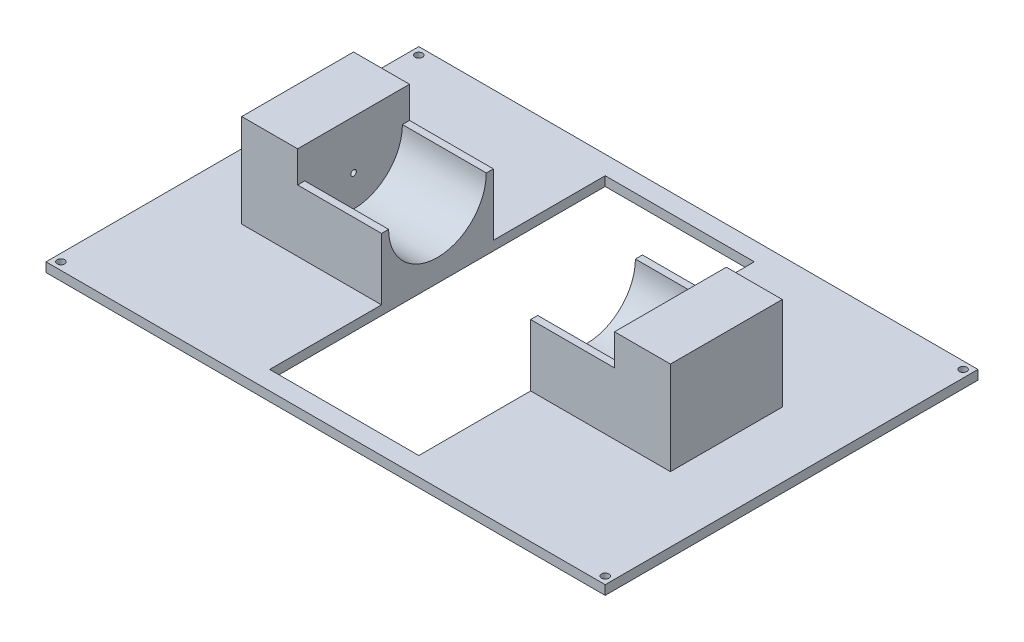
ISO-10303-21;
HEADER;
FILE_DESCRIPTION(('STEP AP214'),'2;1');
FILE_NAME('part.step','',(''),(''),'','','');
FILE_SCHEMA(('AUTOMOTIVE_DESIGN { 1 0 10303 214 1 1 1 1 }'));
ENDSEC;
DATA;
#1=APPLICATION_CONTEXT('core data for automotive mechanical design processes');
#2=APPLICATION_PROTOCOL_DEFINITION('international standard','automotive_design',2000,#1);
#3=PRODUCT_CONTEXT('',#1,'mechanical');
#4=PRODUCT('Part','Part','',(#3));
#5=PRODUCT_RELATED_PRODUCT_CATEGORY('part','',(#4));
#6=PRODUCT_DEFINITION_FORMATION('','',#4);
#7=PRODUCT_DEFINITION_CONTEXT('part definition',#1,'design');
#8=PRODUCT_DEFINITION('design','',#6,#7);
#9=PRODUCT_DEFINITION_SHAPE('','',#8);
#10=(LENGTH_UNIT() NAMED_UNIT(*) SI_UNIT(.MILLI.,.METRE.));
#11=(NAMED_UNIT(*) PLANE_ANGLE_UNIT() SI_UNIT($,.RADIAN.));
#12=(NAMED_UNIT(*) SI_UNIT($,.STERADIAN.) SOLID_ANGLE_UNIT());
#13=UNCERTAINTY_MEASURE_WITH_UNIT(LENGTH_MEASURE(1.E-05),#10,'distance_accuracy_value','');
#14=(GEOMETRIC_REPRESENTATION_CONTEXT(3) GLOBAL_UNCERTAINTY_ASSIGNED_CONTEXT((#13)) GLOBAL_UNIT_ASSIGNED_CONTEXT((#10,
#11,#12)) REPRESENTATION_CONTEXT('',''));
#15=CARTESIAN_POINT('',(0.,0.,0.));
#16=DIRECTION('',(0.,0.,1.));
#17=DIRECTION('',(1.,0.,0.));
#18=AXIS2_PLACEMENT_3D('',#15,#16,#17);
#19=CARTESIAN_POINT('',(0.,5.,0.));
#20=DIRECTION('',(0.,-1.,0.));
#21=DIRECTION('',(0.,0.,-1.));
#22=AXIS2_PLACEMENT_3D('',#19,#20,#21);
#23=PLANE('',#22);
#24=DIRECTION('',(0.,0.,-1.));
#25=VECTOR('',#24,1.);
#26=CARTESIAN_POINT('',(40.,5.,90.));
#27=LINE('',#26,#25);
#28=CARTESIAN_POINT('',(39.9999999999999,5.,-30.));
#29=VERTEX_POINT('',#28);
#30=CARTESIAN_POINT('',(40.,5.,-90.));
#31=VERTEX_POINT('',#30);
#32=EDGE_CURVE('E412',#29,#31,#27,.T.);
#33=ORIENTED_EDGE('',*,*,#32,.F.);
#34=DIRECTION('',(1.,0.,0.));
#35=VECTOR('',#34,1.);
#36=CARTESIAN_POINT('',(84.9999999999999,5.,-30.));
#37=LINE('',#36,#35);
#38=CARTESIAN_POINT('',(115.,5.,-30.));
#39=VERTEX_POINT('',#38);
#40=EDGE_CURVE('E287',#29,#39,#37,.T.);
#41=ORIENTED_EDGE('',*,*,#40,.T.);
#42=DIRECTION('',(0.,0.,1.));
#43=VECTOR('',#42,1.);
#44=CARTESIAN_POINT('',(115.,5.,30.));
#45=LINE('',#44,#43);
#46=CARTESIAN_POINT('',(115.,5.,30.));
#47=VERTEX_POINT('',#46);
#48=EDGE_CURVE('E220',#39,#47,#45,.T.);
#49=ORIENTED_EDGE('',*,*,#48,.T.);
#50=DIRECTION('',(-1.,0.,0.));
#51=VECTOR('',#50,1.);
#52=CARTESIAN_POINT('',(84.9999999999999,5.,30.));
#53=LINE('',#52,#51);
#54=CARTESIAN_POINT('',(39.9999999999999,5.,30.));
#55=VERTEX_POINT('',#54);
#56=EDGE_CURVE('E271',#47,#55,#53,.T.);
#57=ORIENTED_EDGE('',*,*,#56,.T.);
#58=CARTESIAN_POINT('',(40.,5.,90.));
#59=VERTEX_POINT('',#58);
#60=EDGE_CURVE('E413',#59,#55,#27,.T.);
#61=ORIENTED_EDGE('',*,*,#60,.F.);
#62=DIRECTION('',(1.,0.,0.));
#63=VECTOR('',#62,1.);
#64=CARTESIAN_POINT('',(40.,5.,90.));
#65=LINE('',#64,#63);
#66=CARTESIAN_POINT('',(-40.,5.,90.));
#67=VERTEX_POINT('',#66);
#68=EDGE_CURVE('E408',#67,#59,#65,.T.);
#69=ORIENTED_EDGE('',*,*,#68,.F.);
#70=DIRECTION('',(0.,0.,1.));
#71=VECTOR('',#70,1.);
#72=CARTESIAN_POINT('',(-40.,5.,90.));
#73=LINE('',#72,#71);
#74=CARTESIAN_POINT('',(-39.9999999999999,5.,30.));
#75=VERTEX_POINT('',#74);
#76=EDGE_CURVE('E68',#75,#67,#73,.T.);
#77=ORIENTED_EDGE('',*,*,#76,.F.);
#78=DIRECTION('',(1.,0.,0.));
#79=VECTOR('',#78,1.);
#80=CARTESIAN_POINT('',(-84.9999999999999,5.,30.));
#81=LINE('',#80,#79);
#82=CARTESIAN_POINT('',(-115.,5.,30.));
#83=VERTEX_POINT('',#82);
#84=EDGE_CURVE('E61',#83,#75,#81,.T.);
#85=ORIENTED_EDGE('',*,*,#84,.F.);
#86=DIRECTION('',(0.,0.,1.));
#87=VECTOR('',#86,1.);
#88=CARTESIAN_POINT('',(-115.,5.,30.));
#89=LINE('',#88,#87);
#90=CARTESIAN_POINT('',(-115.,5.,-30.));
#91=VERTEX_POINT('',#90);
#92=EDGE_CURVE('E354',#91,#83,#89,.T.);
#93=ORIENTED_EDGE('',*,*,#92,.F.);
#94=DIRECTION('',(-1.,0.,0.));
#95=VECTOR('',#94,1.);
#96=CARTESIAN_POINT('',(-84.9999999999999,5.,-30.));
#97=LINE('',#96,#95);
#98=CARTESIAN_POINT('',(-39.9999999999999,5.,-30.));
#99=VERTEX_POINT('',#98);
#100=EDGE_CURVE('E360',#99,#91,#97,.T.);
#101=ORIENTED_EDGE('',*,*,#100,.F.);
#102=CARTESIAN_POINT('',(-40.,5.,-90.));
#103=VERTEX_POINT('',#102);
#104=EDGE_CURVE('E404',#103,#99,#73,.T.);
#105=ORIENTED_EDGE('',*,*,#104,.F.);
#106=DIRECTION('',(-1.,0.,0.));
#107=VECTOR('',#106,1.);
#108=CARTESIAN_POINT('',(40.,5.,-90.));
#109=LINE('',#108,#107);
#110=EDGE_CURVE('E417',#31,#103,#109,.T.);
#111=ORIENTED_EDGE('',*,*,#110,.F.);
#112=EDGE_LOOP('',(#33,#41,#49,#57,#61,#69,#77,#85,#93,#101,#105,#111));
#113=FACE_BOUND('',#112,.T.);
#114=DIRECTION('',(0.,0.,-1.));
#115=VECTOR('',#114,1.);
#116=CARTESIAN_POINT('',(150.,5.,100.));
#117=LINE('',#116,#115);
#118=CARTESIAN_POINT('',(150.,5.,100.));
#119=VERTEX_POINT('',#118);
#120=CARTESIAN_POINT('',(150.,5.,-100.));
#121=VERTEX_POINT('',#120);
#122=EDGE_CURVE('E471',#119,#121,#117,.T.);
#123=ORIENTED_EDGE('',*,*,#122,.T.);
#124=DIRECTION('',(-1.,0.,0.));
#125=VECTOR('',#124,1.);
#126=CARTESIAN_POINT('',(-150.,5.,-100.));
#127=LINE('',#126,#125);
#128=CARTESIAN_POINT('',(-150.,5.,-100.));
#129=VERTEX_POINT('',#128);
#130=EDGE_CURVE('E475',#121,#129,#127,.T.);
#131=ORIENTED_EDGE('',*,*,#130,.T.);
#132=DIRECTION('',(0.,0.,1.));
#133=VECTOR('',#132,1.);
#134=CARTESIAN_POINT('',(-150.,5.,100.));
#135=LINE('',#134,#133);
#136=CARTESIAN_POINT('',(-150.,5.,100.));
#137=VERTEX_POINT('',#136);
#138=EDGE_CURVE('E479',#129,#137,#135,.T.);
#139=ORIENTED_EDGE('',*,*,#138,.T.);
#140=DIRECTION('',(1.,0.,0.));
#141=VECTOR('',#140,1.);
#142=CARTESIAN_POINT('',(-150.,5.,100.));
#143=LINE('',#142,#141);
#144=EDGE_CURVE('E482',#137,#119,#143,.T.);
#145=ORIENTED_EDGE('',*,*,#144,.T.);
#146=EDGE_LOOP('',(#123,#131,#139,#145));
#147=FACE_BOUND('',#146,.T.);
#148=CARTESIAN_POINT('',(-146.,5.,-96.));
#149=DIRECTION('',(0.,1.,0.));
#150=DIRECTION('',(0.,0.,1.));
#151=AXIS2_PLACEMENT_3D('',#148,#149,#150);
#152=CIRCLE('',#151,2.);
#153=CARTESIAN_POINT('',(-146.,5.,-94.));
#154=VERTEX_POINT('',#153);
#155=EDGE_CURVE('E463',#154,#154,#152,.T.);
#156=ORIENTED_EDGE('',*,*,#155,.F.);
#157=EDGE_LOOP('',(#156));
#158=FACE_BOUND('',#157,.T.);
#159=CARTESIAN_POINT('',(146.,5.,-96.));
#160=DIRECTION('',(0.,1.,0.));
#161=DIRECTION('',(0.,0.,-1.));
#162=AXIS2_PLACEMENT_3D('',#159,#160,#161);
#163=CIRCLE('',#162,2.);
#164=CARTESIAN_POINT('',(146.,5.,-98.));
#165=VERTEX_POINT('',#164);
#166=EDGE_CURVE('E455',#165,#165,#163,.T.);
#167=ORIENTED_EDGE('',*,*,#166,.F.);
#168=EDGE_LOOP('',(#167));
#169=FACE_BOUND('',#168,.T.);
#170=CARTESIAN_POINT('',(146.,5.,96.));
#171=DIRECTION('',(0.,1.,0.));
#172=DIRECTION('',(0.,0.,1.));
#173=AXIS2_PLACEMENT_3D('',#170,#171,#172);
#174=CIRCLE('',#173,2.);
#175=CARTESIAN_POINT('',(146.,5.,98.));
#176=VERTEX_POINT('',#175);
#177=EDGE_CURVE('E447',#176,#176,#174,.T.);
#178=ORIENTED_EDGE('',*,*,#177,.F.);
#179=EDGE_LOOP('',(#178));
#180=FACE_BOUND('',#179,.T.);
#181=CARTESIAN_POINT('',(-146.,5.,96.));
#182=DIRECTION('',(0.,1.,0.));
#183=DIRECTION('',(0.,0.,-1.));
#184=AXIS2_PLACEMENT_3D('',#181,#182,#183);
#185=CIRCLE('',#184,2.);
#186=CARTESIAN_POINT('',(-146.,5.,94.));
#187=VERTEX_POINT('',#186);
#188=EDGE_CURVE('E439',#187,#187,#185,.T.);
#189=ORIENTED_EDGE('',*,*,#188,.F.);
#190=EDGE_LOOP('',(#189));
#191=FACE_BOUND('',#190,.T.);
#192=ADVANCED_FACE('F45',(#113,#147,#158,#169,#180,#191),#23,.F.);
#193=CARTESIAN_POINT('',(-84.9999999999999,55.,30.));
#194=DIRECTION('',(-1.,0.,0.));
#195=DIRECTION('',(0.,0.,1.));
#196=AXIS2_PLACEMENT_3D('',#193,#194,#195);
#197=PLANE('',#196);
#198=CARTESIAN_POINT('',(-84.9999999999999,28.765136385747,0.));
#199=DIRECTION('',(1.,0.,0.));
#200=DIRECTION('',(0.,0.,-1.));
#201=AXIS2_PLACEMENT_3D('',#198,#199,#200);
#202=CIRCLE('',#201,1.5);
#203=CARTESIAN_POINT('',(-84.9999999999999,28.765136385747,-1.5));
#204=VERTEX_POINT('',#203);
#205=EDGE_CURVE('E306',#204,#204,#202,.T.);
#206=ORIENTED_EDGE('',*,*,#205,.F.);
#207=EDGE_LOOP('',(#206));
#208=FACE_BOUND('',#207,.T.);
#209=DIRECTION('',(0.,0.,1.));
#210=VECTOR('',#209,1.);
#211=CARTESIAN_POINT('',(-84.9999999999999,38.1918914228188,26.2));
#212=LINE('',#211,#210);
#213=CARTESIAN_POINT('',(-84.9999999999999,38.1918914228188,26.2));
#214=VERTEX_POINT('',#213);
#215=CARTESIAN_POINT('',(-84.9999999999999,38.1918914228188,30.));
#216=VERTEX_POINT('',#215);
#217=EDGE_CURVE('E336',#214,#216,#212,.T.);
#218=ORIENTED_EDGE('',*,*,#217,.F.);
#219=CARTESIAN_POINT('',(-84.9999999999999,38.1918914228188,0.));
#220=DIRECTION('',(-1.,0.,0.));
#221=DIRECTION('',(0.,0.,-1.));
#222=AXIS2_PLACEMENT_3D('',#219,#220,#221);
#223=CIRCLE('',#222,26.2);
#224=CARTESIAN_POINT('',(-84.9999999999999,38.1918914228188,-26.2));
#225=VERTEX_POINT('',#224);
#226=EDGE_CURVE('E311',#225,#214,#223,.T.);
#227=ORIENTED_EDGE('',*,*,#226,.F.);
#228=DIRECTION('',(0.,0.,1.));
#229=VECTOR('',#228,1.);
#230=CARTESIAN_POINT('',(-84.9999999999999,38.1918914228188,-30.));
#231=LINE('',#230,#229);
#232=CARTESIAN_POINT('',(-84.9999999999999,38.1918914228188,-30.));
#233=VERTEX_POINT('',#232);
#234=EDGE_CURVE('E320',#233,#225,#231,.T.);
#235=ORIENTED_EDGE('',*,*,#234,.F.);
#236=DIRECTION('',(0.,-1.,0.));
#237=VECTOR('',#236,1.);
#238=CARTESIAN_POINT('',(-84.9999999999999,55.,-30.));
#239=LINE('',#238,#237);
#240=CARTESIAN_POINT('',(-84.9999999999999,55.,-30.));
#241=VERTEX_POINT('',#240);
#242=EDGE_CURVE('E381',#241,#233,#239,.T.);
#243=ORIENTED_EDGE('',*,*,#242,.F.);
#244=DIRECTION('',(0.,0.,-1.));
#245=VECTOR('',#244,1.);
#246=CARTESIAN_POINT('',(-84.9999999999999,55.,30.));
#247=LINE('',#246,#245);
#248=CARTESIAN_POINT('',(-84.9999999999999,55.,30.));
#249=VERTEX_POINT('',#248);
#250=EDGE_CURVE('E363',#249,#241,#247,.T.);
#251=ORIENTED_EDGE('',*,*,#250,.F.);
#252=DIRECTION('',(0.,-1.,0.));
#253=VECTOR('',#252,1.);
#254=CARTESIAN_POINT('',(-84.9999999999999,55.,30.));
#255=LINE('',#254,#253);
#256=EDGE_CURVE('E385',#249,#216,#255,.T.);
#257=ORIENTED_EDGE('',*,*,#256,.T.);
#258=EDGE_LOOP('',(#218,#227,#235,#243,#251,#257));
#259=FACE_BOUND('',#258,.T.);
#260=ADVANCED_FACE('F534',(#208,#259),#197,.F.);
#261=CARTESIAN_POINT('',(0.,0.,0.));
#262=DIRECTION('',(0.,-1.,0.));
#263=DIRECTION('',(0.,0.,-1.));
#264=AXIS2_PLACEMENT_3D('',#261,#262,#263);
#265=PLANE('',#264);
#266=DIRECTION('',(0.,0.,1.));
#267=VECTOR('',#266,1.);
#268=CARTESIAN_POINT('',(-40.,0.,90.));
#269=LINE('',#268,#267);
#270=CARTESIAN_POINT('',(-40.,0.,-90.));
#271=VERTEX_POINT('',#270);
#272=CARTESIAN_POINT('',(-40.,0.,90.));
#273=VERTEX_POINT('',#272);
#274=EDGE_CURVE('E400',#271,#273,#269,.T.);
#275=ORIENTED_EDGE('',*,*,#274,.T.);
#276=DIRECTION('',(1.,0.,0.));
#277=VECTOR('',#276,1.);
#278=CARTESIAN_POINT('',(40.,0.,90.));
#279=LINE('',#278,#277);
#280=CARTESIAN_POINT('',(40.,0.,90.));
#281=VERTEX_POINT('',#280);
#282=EDGE_CURVE('E425',#273,#281,#279,.T.);
#283=ORIENTED_EDGE('',*,*,#282,.T.);
#284=DIRECTION('',(0.,0.,-1.));
#285=VECTOR('',#284,1.);
#286=CARTESIAN_POINT('',(40.,0.,90.));
#287=LINE('',#286,#285);
#288=CARTESIAN_POINT('',(40.,0.,-90.));
#289=VERTEX_POINT('',#288);
#290=EDGE_CURVE('E392',#281,#289,#287,.T.);
#291=ORIENTED_EDGE('',*,*,#290,.T.);
#292=DIRECTION('',(-1.,0.,0.));
#293=VECTOR('',#292,1.);
#294=CARTESIAN_POINT('',(40.,0.,-90.));
#295=LINE('',#294,#293);
#296=EDGE_CURVE('E396',#289,#271,#295,.T.);
#297=ORIENTED_EDGE('',*,*,#296,.T.);
#298=EDGE_LOOP('',(#275,#283,#291,#297));
#299=FACE_BOUND('',#298,.T.);
#300=CARTESIAN_POINT('',(146.,0.,96.));
#301=DIRECTION('',(0.,1.,0.));
#302=DIRECTION('',(0.,0.,1.));
#303=AXIS2_PLACEMENT_3D('',#300,#301,#302);
#304=CIRCLE('',#303,2.);
#305=CARTESIAN_POINT('',(146.,0.,98.));
#306=VERTEX_POINT('',#305);
#307=EDGE_CURVE('E443',#306,#306,#304,.T.);
#308=ORIENTED_EDGE('',*,*,#307,.T.);
#309=EDGE_LOOP('',(#308));
#310=FACE_BOUND('',#309,.T.);
#311=CARTESIAN_POINT('',(-146.,0.,-96.));
#312=DIRECTION('',(0.,1.,0.));
#313=DIRECTION('',(0.,0.,1.));
#314=AXIS2_PLACEMENT_3D('',#311,#312,#313);
#315=CIRCLE('',#314,2.);
#316=CARTESIAN_POINT('',(-146.,0.,-94.));
#317=VERTEX_POINT('',#316);
#318=EDGE_CURVE('E459',#317,#317,#315,.T.);
#319=ORIENTED_EDGE('',*,*,#318,.T.);
#320=EDGE_LOOP('',(#319));
#321=FACE_BOUND('',#320,.T.);
#322=DIRECTION('',(0.,0.,-1.));
#323=VECTOR('',#322,1.);
#324=CARTESIAN_POINT('',(150.,0.,100.));
#325=LINE('',#324,#323);
#326=CARTESIAN_POINT('',(150.,0.,100.));
#327=VERTEX_POINT('',#326);
#328=CARTESIAN_POINT('',(150.,0.,-100.));
#329=VERTEX_POINT('',#328);
#330=EDGE_CURVE('E467',#327,#329,#325,.T.);
#331=ORIENTED_EDGE('',*,*,#330,.F.);
#332=DIRECTION('',(1.,0.,0.));
#333=VECTOR('',#332,1.);
#334=CARTESIAN_POINT('',(-150.,0.,100.));
#335=LINE('',#334,#333);
#336=CARTESIAN_POINT('',(-150.,0.,100.));
#337=VERTEX_POINT('',#336);
#338=EDGE_CURVE('E476',#337,#327,#335,.T.);
#339=ORIENTED_EDGE('',*,*,#338,.F.);
#340=DIRECTION('',(0.,0.,1.));
#341=VECTOR('',#340,1.);
#342=CARTESIAN_POINT('',(-150.,0.,100.));
#343=LINE('',#342,#341);
#344=CARTESIAN_POINT('',(-150.,0.,-100.));
#345=VERTEX_POINT('',#344);
#346=EDGE_CURVE('E492',#345,#337,#343,.T.);
#347=ORIENTED_EDGE('',*,*,#346,.F.);
#348=DIRECTION('',(-1.,0.,0.));
#349=VECTOR('',#348,1.);
#350=CARTESIAN_POINT('',(-150.,0.,-100.));
#351=LINE('',#350,#349);
#352=EDGE_CURVE('E489',#329,#345,#351,.T.);
#353=ORIENTED_EDGE('',*,*,#352,.F.);
#354=EDGE_LOOP('',(#331,#339,#347,#353));
#355=FACE_BOUND('',#354,.T.);
#356=CARTESIAN_POINT('',(146.,0.,-96.));
#357=DIRECTION('',(0.,1.,0.));
#358=DIRECTION('',(0.,0.,-1.));
#359=AXIS2_PLACEMENT_3D('',#356,#357,#358);
#360=CIRCLE('',#359,2.);
#361=CARTESIAN_POINT('',(146.,0.,-98.));
#362=VERTEX_POINT('',#361);
#363=EDGE_CURVE('E451',#362,#362,#360,.T.);
#364=ORIENTED_EDGE('',*,*,#363,.T.);
#365=EDGE_LOOP('',(#364));
#366=FACE_BOUND('',#365,.T.);
#367=CARTESIAN_POINT('',(-146.,0.,96.));
#368=DIRECTION('',(0.,1.,0.));
#369=DIRECTION('',(0.,0.,-1.));
#370=AXIS2_PLACEMENT_3D('',#367,#368,#369);
#371=CIRCLE('',#370,2.);
#372=CARTESIAN_POINT('',(-146.,0.,94.));
#373=VERTEX_POINT('',#372);
#374=EDGE_CURVE('E438',#373,#373,#371,.T.);
#375=ORIENTED_EDGE('',*,*,#374,.T.);
#376=EDGE_LOOP('',(#375));
#377=FACE_BOUND('',#376,.T.);
#378=ADVANCED_FACE('F515',(#299,#310,#321,#355,#366,#377),#265,.T.);
#379=CARTESIAN_POINT('',(150.,5.,100.));
#380=DIRECTION('',(-1.,0.,0.));
#381=DIRECTION('',(0.,0.,1.));
#382=AXIS2_PLACEMENT_3D('',#379,#380,#381);
#383=PLANE('',#382);
#384=ORIENTED_EDGE('',*,*,#330,.T.);
#385=DIRECTION('',(0.,-1.,0.));
#386=VECTOR('',#385,1.);
#387=CARTESIAN_POINT('',(150.,5.,-100.));
#388=LINE('',#387,#386);
#389=EDGE_CURVE('E11',#121,#329,#388,.T.);
#390=ORIENTED_EDGE('',*,*,#389,.F.);
#391=ORIENTED_EDGE('',*,*,#122,.F.);
#392=DIRECTION('',(0.,-1.,0.));
#393=VECTOR('',#392,1.);
#394=CARTESIAN_POINT('',(150.,5.,100.));
#395=LINE('',#394,#393);
#396=EDGE_CURVE('E485',#119,#327,#395,.T.);
#397=ORIENTED_EDGE('',*,*,#396,.T.);
#398=EDGE_LOOP('',(#384,#390,#391,#397));
#399=FACE_BOUND('',#398,.T.);
#400=ADVANCED_FACE('F47',(#399),#383,.F.);
#401=CARTESIAN_POINT('',(-150.,5.,-100.));
#402=DIRECTION('',(0.,0.,1.));
#403=DIRECTION('',(1.,0.,0.));
#404=AXIS2_PLACEMENT_3D('',#401,#402,#403);
#405=PLANE('',#404);
#406=ORIENTED_EDGE('',*,*,#352,.T.);
#407=DIRECTION('',(0.,-1.,0.));
#408=VECTOR('',#407,1.);
#409=CARTESIAN_POINT('',(-150.,5.,-100.));
#410=LINE('',#409,#408);
#411=EDGE_CURVE('E54',#129,#345,#410,.T.);
#412=ORIENTED_EDGE('',*,*,#411,.F.);
#413=ORIENTED_EDGE('',*,*,#130,.F.);
#414=ORIENTED_EDGE('',*,*,#389,.T.);
#415=EDGE_LOOP('',(#406,#412,#413,#414));
#416=FACE_BOUND('',#415,.T.);
#417=ADVANCED_FACE('F526',(#416),#405,.F.);
#418=CARTESIAN_POINT('',(-150.,5.,100.));
#419=DIRECTION('',(1.,0.,0.));
#420=DIRECTION('',(0.,0.,-1.));
#421=AXIS2_PLACEMENT_3D('',#418,#419,#420);
#422=PLANE('',#421);
#423=ORIENTED_EDGE('',*,*,#346,.T.);
#424=DIRECTION('',(0.,-1.,0.));
#425=VECTOR('',#424,1.);
#426=CARTESIAN_POINT('',(-150.,5.,100.));
#427=LINE('',#426,#425);
#428=EDGE_CURVE('E500',#137,#337,#427,.T.);
#429=ORIENTED_EDGE('',*,*,#428,.F.);
#430=ORIENTED_EDGE('',*,*,#138,.F.);
#431=ORIENTED_EDGE('',*,*,#411,.T.);
#432=EDGE_LOOP('',(#423,#429,#430,#431));
#433=FACE_BOUND('',#432,.T.);
#434=ADVANCED_FACE('F509',(#433),#422,.F.);
#435=CARTESIAN_POINT('',(-150.,5.,100.));
#436=DIRECTION('',(0.,0.,-1.));
#437=DIRECTION('',(-1.,0.,0.));
#438=AXIS2_PLACEMENT_3D('',#435,#436,#437);
#439=PLANE('',#438);
#440=ORIENTED_EDGE('',*,*,#338,.T.);
#441=ORIENTED_EDGE('',*,*,#396,.F.);
#442=ORIENTED_EDGE('',*,*,#144,.F.);
#443=ORIENTED_EDGE('',*,*,#428,.T.);
#444=EDGE_LOOP('',(#440,#441,#442,#443));
#445=FACE_BOUND('',#444,.T.);
#446=ADVANCED_FACE('F519',(#445),#439,.F.);
#447=CARTESIAN_POINT('',(-146.,5.,-96.));
#448=DIRECTION('',(0.,-1.,0.));
#449=DIRECTION('',(0.,0.,-1.));
#450=AXIS2_PLACEMENT_3D('',#447,#448,#449);
#451=CYLINDRICAL_SURFACE('',#450,2.);
#452=ORIENTED_EDGE('',*,*,#155,.T.);
#453=EDGE_LOOP('',(#452));
#454=FACE_BOUND('',#453,.T.);
#455=ORIENTED_EDGE('',*,*,#318,.F.);
#456=EDGE_LOOP('',(#455));
#457=FACE_BOUND('',#456,.T.);
#458=ADVANCED_FACE('F546',(#454,#457),#451,.F.);
#459=CARTESIAN_POINT('',(146.,5.,-96.));
#460=DIRECTION('',(0.,-1.,0.));
#461=DIRECTION('',(0.,0.,-1.));
#462=AXIS2_PLACEMENT_3D('',#459,#460,#461);
#463=CYLINDRICAL_SURFACE('',#462,2.);
#464=ORIENTED_EDGE('',*,*,#166,.T.);
#465=EDGE_LOOP('',(#464));
#466=FACE_BOUND('',#465,.T.);
#467=ORIENTED_EDGE('',*,*,#363,.F.);
#468=EDGE_LOOP('',(#467));
#469=FACE_BOUND('',#468,.T.);
#470=ADVANCED_FACE('F555',(#466,#469),#463,.F.);
#471=CARTESIAN_POINT('',(146.,5.,96.));
#472=DIRECTION('',(0.,-1.,0.));
#473=DIRECTION('',(0.,0.,-1.));
#474=AXIS2_PLACEMENT_3D('',#471,#472,#473);
#475=CYLINDRICAL_SURFACE('',#474,2.);
#476=ORIENTED_EDGE('',*,*,#177,.T.);
#477=EDGE_LOOP('',(#476));
#478=FACE_BOUND('',#477,.T.);
#479=ORIENTED_EDGE('',*,*,#307,.F.);
#480=EDGE_LOOP('',(#479));
#481=FACE_BOUND('',#480,.T.);
#482=ADVANCED_FACE('F560',(#478,#481),#475,.F.);
#483=CARTESIAN_POINT('',(-146.,5.,96.));
#484=DIRECTION('',(0.,-1.,0.));
#485=DIRECTION('',(0.,0.,-1.));
#486=AXIS2_PLACEMENT_3D('',#483,#484,#485);
#487=CYLINDRICAL_SURFACE('',#486,2.);
#488=ORIENTED_EDGE('',*,*,#188,.T.);
#489=EDGE_LOOP('',(#488));
#490=FACE_BOUND('',#489,.T.);
#491=ORIENTED_EDGE('',*,*,#374,.F.);
#492=EDGE_LOOP('',(#491));
#493=FACE_BOUND('',#492,.T.);
#494=ADVANCED_FACE('F573',(#490,#493),#487,.F.);
#495=CARTESIAN_POINT('',(-40.,-0.00100000000000013,90.));
#496=DIRECTION('',(-1.,0.,0.));
#497=DIRECTION('',(0.,0.,1.));
#498=AXIS2_PLACEMENT_3D('',#495,#496,#497);
#499=PLANE('',#498);
#500=DIRECTION('',(0.,1.,0.));
#501=VECTOR('',#500,1.);
#502=CARTESIAN_POINT('',(-40.,-0.00100000000000013,-90.));
#503=LINE('',#502,#501);
#504=EDGE_CURVE('E422',#271,#103,#503,.T.);
#505=ORIENTED_EDGE('',*,*,#504,.T.);
#506=ORIENTED_EDGE('',*,*,#104,.T.);
#507=DIRECTION('',(0.,1.,0.));
#508=VECTOR('',#507,1.);
#509=CARTESIAN_POINT('',(-39.9999999999999,5.,-30.));
#510=LINE('',#509,#508);
#511=CARTESIAN_POINT('',(-39.9999999999999,38.1918914228188,-30.));
#512=VERTEX_POINT('',#511);
#513=EDGE_CURVE('E326',#99,#512,#510,.T.);
#514=ORIENTED_EDGE('',*,*,#513,.T.);
#515=DIRECTION('',(0.,0.,1.));
#516=VECTOR('',#515,1.);
#517=CARTESIAN_POINT('',(-39.9999999999999,38.1918914228188,-30.));
#518=LINE('',#517,#516);
#519=CARTESIAN_POINT('',(-39.9999999999999,38.1918914228188,-26.2));
#520=VERTEX_POINT('',#519);
#521=EDGE_CURVE('E329',#512,#520,#518,.T.);
#522=ORIENTED_EDGE('',*,*,#521,.T.);
#523=CARTESIAN_POINT('',(-39.9999999999999,38.1918914228188,0.));
#524=DIRECTION('',(-1.,0.,0.));
#525=DIRECTION('',(0.,0.,-1.));
#526=AXIS2_PLACEMENT_3D('',#523,#524,#525);
#527=CIRCLE('',#526,26.2);
#528=CARTESIAN_POINT('',(-39.9999999999999,38.1918914228188,26.2));
#529=VERTEX_POINT('',#528);
#530=EDGE_CURVE('E315',#520,#529,#527,.T.);
#531=ORIENTED_EDGE('',*,*,#530,.T.);
#532=DIRECTION('',(0.,0.,1.));
#533=VECTOR('',#532,1.);
#534=CARTESIAN_POINT('',(-39.9999999999999,38.1918914228188,26.2));
#535=LINE('',#534,#533);
#536=CARTESIAN_POINT('',(-39.9999999999999,38.1918914228188,30.));
#537=VERTEX_POINT('',#536);
#538=EDGE_CURVE('E319',#529,#537,#535,.T.);
#539=ORIENTED_EDGE('',*,*,#538,.T.);
#540=DIRECTION('',(0.,-1.,0.));
#541=VECTOR('',#540,1.);
#542=CARTESIAN_POINT('',(-39.9999999999999,38.1918914228188,30.));
#543=LINE('',#542,#541);
#544=EDGE_CURVE('E323',#537,#75,#543,.T.);
#545=ORIENTED_EDGE('',*,*,#544,.T.);
#546=ORIENTED_EDGE('',*,*,#76,.T.);
#547=DIRECTION('',(0.,1.,0.));
#548=VECTOR('',#547,1.);
#549=CARTESIAN_POINT('',(-40.,-0.00100000000000013,90.));
#550=LINE('',#549,#548);
#551=EDGE_CURVE('E421',#273,#67,#550,.T.);
#552=ORIENTED_EDGE('',*,*,#551,.F.);
#553=ORIENTED_EDGE('',*,*,#274,.F.);
#554=EDGE_LOOP('',(#505,#506,#514,#522,#531,#539,#545,#546,#552,#553));
#555=FACE_BOUND('',#554,.T.);
#556=ADVANCED_FACE('F576',(#555),#499,.F.);
#557=CARTESIAN_POINT('',(40.,-0.00100000000000013,-90.));
#558=DIRECTION('',(0.,0.,-1.));
#559=DIRECTION('',(-1.,0.,0.));
#560=AXIS2_PLACEMENT_3D('',#557,#558,#559);
#561=PLANE('',#560);
#562=DIRECTION('',(0.,1.,0.));
#563=VECTOR('',#562,1.);
#564=CARTESIAN_POINT('',(40.,-0.00100000000000013,-90.));
#565=LINE('',#564,#563);
#566=EDGE_CURVE('E426',#289,#31,#565,.T.);
#567=ORIENTED_EDGE('',*,*,#566,.T.);
#568=ORIENTED_EDGE('',*,*,#110,.T.);
#569=ORIENTED_EDGE('',*,*,#504,.F.);
#570=ORIENTED_EDGE('',*,*,#296,.F.);
#571=EDGE_LOOP('',(#567,#568,#569,#570));
#572=FACE_BOUND('',#571,.T.);
#573=ADVANCED_FACE('F584',(#572),#561,.F.);
#574=CARTESIAN_POINT('',(40.,-0.00100000000000013,90.));
#575=DIRECTION('',(1.,0.,0.));
#576=DIRECTION('',(0.,0.,-1.));
#577=AXIS2_PLACEMENT_3D('',#574,#575,#576);
#578=PLANE('',#577);
#579=DIRECTION('',(0.,1.,0.));
#580=VECTOR('',#579,1.);
#581=CARTESIAN_POINT('',(40.,-0.00100000000000013,90.));
#582=LINE('',#581,#580);
#583=EDGE_CURVE('E430',#281,#59,#582,.T.);
#584=ORIENTED_EDGE('',*,*,#583,.T.);
#585=ORIENTED_EDGE('',*,*,#60,.T.);
#586=DIRECTION('',(0.,-1.,0.));
#587=VECTOR('',#586,1.);
#588=CARTESIAN_POINT('',(39.9999999999999,38.1918914228188,30.));
#589=LINE('',#588,#587);
#590=CARTESIAN_POINT('',(39.9999999999999,38.1918914228188,30.));
#591=VERTEX_POINT('',#590);
#592=EDGE_CURVE('E240',#591,#55,#589,.T.);
#593=ORIENTED_EDGE('',*,*,#592,.F.);
#594=DIRECTION('',(0.,0.,1.));
#595=VECTOR('',#594,1.);
#596=CARTESIAN_POINT('',(39.9999999999999,38.1918914228188,26.2));
#597=LINE('',#596,#595);
#598=CARTESIAN_POINT('',(39.9999999999999,38.1918914228188,26.2));
#599=VERTEX_POINT('',#598);
#600=EDGE_CURVE('E231',#599,#591,#597,.T.);
#601=ORIENTED_EDGE('',*,*,#600,.F.);
#602=CARTESIAN_POINT('',(39.9999999999999,38.1918914228188,0.));
#603=DIRECTION('',(-1.,0.,0.));
#604=DIRECTION('',(0.,0.,-1.));
#605=AXIS2_PLACEMENT_3D('',#602,#603,#604);
#606=CIRCLE('',#605,26.2);
#607=CARTESIAN_POINT('',(39.9999999999999,38.1918914228188,-26.2));
#608=VERTEX_POINT('',#607);
#609=EDGE_CURVE('E211',#608,#599,#606,.T.);
#610=ORIENTED_EDGE('',*,*,#609,.F.);
#611=DIRECTION('',(0.,0.,1.));
#612=VECTOR('',#611,1.);
#613=CARTESIAN_POINT('',(39.9999999999999,38.1918914228188,-30.));
#614=LINE('',#613,#612);
#615=CARTESIAN_POINT('',(39.9999999999999,38.1918914228188,-30.));
#616=VERTEX_POINT('',#615);
#617=EDGE_CURVE('E227',#616,#608,#614,.T.);
#618=ORIENTED_EDGE('',*,*,#617,.F.);
#619=DIRECTION('',(0.,1.,0.));
#620=VECTOR('',#619,1.);
#621=CARTESIAN_POINT('',(39.9999999999999,5.,-30.));
#622=LINE('',#621,#620);
#623=EDGE_CURVE('E237',#29,#616,#622,.T.);
#624=ORIENTED_EDGE('',*,*,#623,.F.);
#625=ORIENTED_EDGE('',*,*,#32,.T.);
#626=ORIENTED_EDGE('',*,*,#566,.F.);
#627=ORIENTED_EDGE('',*,*,#290,.F.);
#628=EDGE_LOOP('',(#584,#585,#593,#601,#610,#618,#624,#625,#626,#627));
#629=FACE_BOUND('',#628,.T.);
#630=ADVANCED_FACE('F225',(#629),#578,.F.);
#631=CARTESIAN_POINT('',(40.,-0.00100000000000013,90.));
#632=DIRECTION('',(0.,0.,1.));
#633=DIRECTION('',(1.,0.,0.));
#634=AXIS2_PLACEMENT_3D('',#631,#632,#633);
#635=PLANE('',#634);
#636=ORIENTED_EDGE('',*,*,#551,.T.);
#637=ORIENTED_EDGE('',*,*,#68,.T.);
#638=ORIENTED_EDGE('',*,*,#583,.F.);
#639=ORIENTED_EDGE('',*,*,#282,.F.);
#640=EDGE_LOOP('',(#636,#637,#638,#639));
#641=FACE_BOUND('',#640,.T.);
#642=ADVANCED_FACE('F589',(#641),#635,.F.);
#643=CARTESIAN_POINT('',(-115.,55.,30.));
#644=DIRECTION('',(1.,0.,0.));
#645=DIRECTION('',(0.,0.,-1.));
#646=AXIS2_PLACEMENT_3D('',#643,#644,#645);
#647=PLANE('',#646);
#648=ORIENTED_EDGE('',*,*,#92,.T.);
#649=DIRECTION('',(0.,-1.,0.));
#650=VECTOR('',#649,1.);
#651=CARTESIAN_POINT('',(-115.,55.,30.));
#652=LINE('',#651,#650);
#653=CARTESIAN_POINT('',(-115.,55.,30.));
#654=VERTEX_POINT('',#653);
#655=EDGE_CURVE('E389',#654,#83,#652,.T.);
#656=ORIENTED_EDGE('',*,*,#655,.F.);
#657=DIRECTION('',(0.,0.,1.));
#658=VECTOR('',#657,1.);
#659=CARTESIAN_POINT('',(-115.,55.,30.));
#660=LINE('',#659,#658);
#661=CARTESIAN_POINT('',(-115.,55.,-30.));
#662=VERTEX_POINT('',#661);
#663=EDGE_CURVE('E355',#662,#654,#660,.T.);
#664=ORIENTED_EDGE('',*,*,#663,.F.);
#665=DIRECTION('',(0.,-1.,0.));
#666=VECTOR('',#665,1.);
#667=CARTESIAN_POINT('',(-115.,55.,-30.));
#668=LINE('',#667,#666);
#669=EDGE_CURVE('E369',#662,#91,#668,.T.);
#670=ORIENTED_EDGE('',*,*,#669,.T.);
#671=EDGE_LOOP('',(#648,#656,#664,#670));
#672=FACE_BOUND('',#671,.T.);
#673=ADVANCED_FACE('F592',(#672),#647,.F.);
#674=CARTESIAN_POINT('',(-84.9999999999999,55.,30.));
#675=DIRECTION('',(0.,0.,-1.));
#676=DIRECTION('',(-1.,0.,0.));
#677=AXIS2_PLACEMENT_3D('',#674,#675,#676);
#678=PLANE('',#677);
#679=ORIENTED_EDGE('',*,*,#84,.T.);
#680=ORIENTED_EDGE('',*,*,#544,.F.);
#681=DIRECTION('',(-1.,0.,0.));
#682=VECTOR('',#681,1.);
#683=CARTESIAN_POINT('',(-39.9999999999999,38.1918914228188,30.));
#684=LINE('',#683,#682);
#685=EDGE_CURVE('E347',#537,#216,#684,.T.);
#686=ORIENTED_EDGE('',*,*,#685,.T.);
#687=ORIENTED_EDGE('',*,*,#256,.F.);
#688=DIRECTION('',(1.,0.,0.));
#689=VECTOR('',#688,1.);
#690=CARTESIAN_POINT('',(-84.9999999999999,55.,30.));
#691=LINE('',#690,#689);
#692=EDGE_CURVE('E359',#654,#249,#691,.T.);
#693=ORIENTED_EDGE('',*,*,#692,.F.);
#694=ORIENTED_EDGE('',*,*,#655,.T.);
#695=EDGE_LOOP('',(#679,#680,#686,#687,#693,#694));
#696=FACE_BOUND('',#695,.T.);
#697=ADVANCED_FACE('F601',(#696),#678,.F.);
#698=CARTESIAN_POINT('',(-84.9999999999999,55.,-30.));
#699=DIRECTION('',(0.,0.,1.));
#700=DIRECTION('',(1.,0.,0.));
#701=AXIS2_PLACEMENT_3D('',#698,#699,#700);
#702=PLANE('',#701);
#703=ORIENTED_EDGE('',*,*,#100,.T.);
#704=ORIENTED_EDGE('',*,*,#669,.F.);
#705=DIRECTION('',(-1.,0.,0.));
#706=VECTOR('',#705,1.);
#707=CARTESIAN_POINT('',(-84.9999999999999,55.,-30.));
#708=LINE('',#707,#706);
#709=EDGE_CURVE('E366',#241,#662,#708,.T.);
#710=ORIENTED_EDGE('',*,*,#709,.F.);
#711=ORIENTED_EDGE('',*,*,#242,.T.);
#712=DIRECTION('',(-1.,0.,0.));
#713=VECTOR('',#712,1.);
#714=CARTESIAN_POINT('',(-39.9999999999999,38.1918914228188,-30.));
#715=LINE('',#714,#713);
#716=EDGE_CURVE('E344',#512,#233,#715,.T.);
#717=ORIENTED_EDGE('',*,*,#716,.F.);
#718=ORIENTED_EDGE('',*,*,#513,.F.);
#719=EDGE_LOOP('',(#703,#704,#710,#711,#717,#718));
#720=FACE_BOUND('',#719,.T.);
#721=ADVANCED_FACE('F604',(#720),#702,.F.);
#722=CARTESIAN_POINT('',(0.,55.,0.));
#723=DIRECTION('',(0.,1.,0.));
#724=DIRECTION('',(0.,0.,1.));
#725=AXIS2_PLACEMENT_3D('',#722,#723,#724);
#726=PLANE('',#725);
#727=ORIENTED_EDGE('',*,*,#663,.T.);
#728=ORIENTED_EDGE('',*,*,#692,.T.);
#729=ORIENTED_EDGE('',*,*,#250,.T.);
#730=ORIENTED_EDGE('',*,*,#709,.T.);
#731=EDGE_LOOP('',(#727,#728,#729,#730));
#732=FACE_BOUND('',#731,.T.);
#733=ADVANCED_FACE('F609',(#732),#726,.T.);
#734=CARTESIAN_POINT('',(-39.9999999999999,38.1918914228188,0.));
#735=DIRECTION('',(-1.,0.,0.));
#736=DIRECTION('',(0.,0.,1.));
#737=AXIS2_PLACEMENT_3D('',#734,#735,#736);
#738=CYLINDRICAL_SURFACE('',#737,26.2);
#739=ORIENTED_EDGE('',*,*,#226,.T.);
#740=DIRECTION('',(-1.,0.,0.));
#741=VECTOR('',#740,1.);
#742=CARTESIAN_POINT('',(-39.9999999999999,38.1918914228188,26.2));
#743=LINE('',#742,#741);
#744=EDGE_CURVE('E351',#529,#214,#743,.T.);
#745=ORIENTED_EDGE('',*,*,#744,.F.);
#746=ORIENTED_EDGE('',*,*,#530,.F.);
#747=DIRECTION('',(-1.,0.,0.));
#748=VECTOR('',#747,1.);
#749=CARTESIAN_POINT('',(-39.9999999999999,38.1918914228188,-26.2));
#750=LINE('',#749,#748);
#751=EDGE_CURVE('E332',#520,#225,#750,.T.);
#752=ORIENTED_EDGE('',*,*,#751,.T.);
#753=EDGE_LOOP('',(#739,#745,#746,#752));
#754=FACE_BOUND('',#753,.T.);
#755=ADVANCED_FACE('F613',(#754),#738,.F.);
#756=CARTESIAN_POINT('',(-39.9999999999999,38.1918914228188,26.2));
#757=DIRECTION('',(0.,-1.,0.));
#758=DIRECTION('',(0.,0.,-1.));
#759=AXIS2_PLACEMENT_3D('',#756,#757,#758);
#760=PLANE('',#759);
#761=ORIENTED_EDGE('',*,*,#217,.T.);
#762=ORIENTED_EDGE('',*,*,#685,.F.);
#763=ORIENTED_EDGE('',*,*,#538,.F.);
#764=ORIENTED_EDGE('',*,*,#744,.T.);
#765=EDGE_LOOP('',(#761,#762,#763,#764));
#766=FACE_BOUND('',#765,.T.);
#767=ADVANCED_FACE('F617',(#766),#760,.F.);
#768=CARTESIAN_POINT('',(-39.9999999999999,38.1918914228188,-30.));
#769=DIRECTION('',(0.,-1.,0.));
#770=DIRECTION('',(0.,0.,-1.));
#771=AXIS2_PLACEMENT_3D('',#768,#769,#770);
#772=PLANE('',#771);
#773=ORIENTED_EDGE('',*,*,#234,.T.);
#774=ORIENTED_EDGE('',*,*,#751,.F.);
#775=ORIENTED_EDGE('',*,*,#521,.F.);
#776=ORIENTED_EDGE('',*,*,#716,.T.);
#777=EDGE_LOOP('',(#773,#774,#775,#776));
#778=FACE_BOUND('',#777,.T.);
#779=ADVANCED_FACE('F621',(#778),#772,.F.);
#780=CARTESIAN_POINT('',(-89.9999999999999,28.765136385747,0.));
#781=DIRECTION('',(1.,0.,0.));
#782=DIRECTION('',(0.,0.,-1.));
#783=AXIS2_PLACEMENT_3D('',#780,#781,#782);
#784=CYLINDRICAL_SURFACE('',#783,1.5);
#785=CARTESIAN_POINT('',(-89.9999999999999,28.765136385747,0.));
#786=DIRECTION('',(1.,0.,0.));
#787=DIRECTION('',(0.,0.,-1.));
#788=AXIS2_PLACEMENT_3D('',#785,#786,#787);
#789=CIRCLE('',#788,1.5);
#790=CARTESIAN_POINT('',(-89.9999999999999,28.765136385747,-1.5));
#791=VERTEX_POINT('',#790);
#792=EDGE_CURVE('E307',#791,#791,#789,.T.);
#793=ORIENTED_EDGE('',*,*,#792,.F.);
#794=EDGE_LOOP('',(#793));
#795=FACE_BOUND('',#794,.T.);
#796=ORIENTED_EDGE('',*,*,#205,.T.);
#797=EDGE_LOOP('',(#796));
#798=FACE_BOUND('',#797,.T.);
#799=ADVANCED_FACE('F625',(#795,#798),#784,.F.);
#800=CARTESIAN_POINT('',(-89.9999999999999,28.765136385747,0.));
#801=DIRECTION('',(1.,0.,0.));
#802=DIRECTION('',(0.,0.,-1.));
#803=AXIS2_PLACEMENT_3D('',#800,#801,#802);
#804=PLANE('',#803);
#805=ORIENTED_EDGE('',*,*,#792,.T.);
#806=EDGE_LOOP('',(#805));
#807=FACE_BOUND('',#806,.T.);
#808=ADVANCED_FACE('F629',(#807),#804,.T.);
#809=CARTESIAN_POINT('',(115.,55.,30.));
#810=DIRECTION('',(1.,0.,0.));
#811=DIRECTION('',(0.,0.,-1.));
#812=AXIS2_PLACEMENT_3D('',#809,#810,#811);
#813=PLANE('',#812);
#814=ORIENTED_EDGE('',*,*,#48,.F.);
#815=DIRECTION('',(0.,-1.,0.));
#816=VECTOR('',#815,1.);
#817=CARTESIAN_POINT('',(115.,55.,-30.));
#818=LINE('',#817,#816);
#819=CARTESIAN_POINT('',(115.,55.,-30.));
#820=VERTEX_POINT('',#819);
#821=EDGE_CURVE('E303',#820,#39,#818,.T.);
#822=ORIENTED_EDGE('',*,*,#821,.F.);
#823=DIRECTION('',(0.,0.,1.));
#824=VECTOR('',#823,1.);
#825=CARTESIAN_POINT('',(115.,55.,30.));
#826=LINE('',#825,#824);
#827=CARTESIAN_POINT('',(115.,55.,30.));
#828=VERTEX_POINT('',#827);
#829=EDGE_CURVE('E266',#820,#828,#826,.T.);
#830=ORIENTED_EDGE('',*,*,#829,.T.);
#831=DIRECTION('',(0.,-1.,0.));
#832=VECTOR('',#831,1.);
#833=CARTESIAN_POINT('',(115.,55.,30.));
#834=LINE('',#833,#832);
#835=EDGE_CURVE('E283',#828,#47,#834,.T.);
#836=ORIENTED_EDGE('',*,*,#835,.T.);
#837=EDGE_LOOP('',(#814,#822,#830,#836));
#838=FACE_BOUND('',#837,.T.);
#839=ADVANCED_FACE('F633',(#838),#813,.T.);
#840=CARTESIAN_POINT('',(84.9999999999999,55.,-30.));
#841=DIRECTION('',(0.,0.,-1.));
#842=DIRECTION('',(-1.,0.,0.));
#843=AXIS2_PLACEMENT_3D('',#840,#841,#842);
#844=PLANE('',#843);
#845=ORIENTED_EDGE('',*,*,#40,.F.);
#846=ORIENTED_EDGE('',*,*,#623,.T.);
#847=DIRECTION('',(1.,0.,0.));
#848=VECTOR('',#847,1.);
#849=CARTESIAN_POINT('',(39.9999999999999,38.1918914228188,-30.));
#850=LINE('',#849,#848);
#851=CARTESIAN_POINT('',(84.9999999999999,38.1918914228188,-30.));
#852=VERTEX_POINT('',#851);
#853=EDGE_CURVE('E221',#616,#852,#850,.T.);
#854=ORIENTED_EDGE('',*,*,#853,.T.);
#855=DIRECTION('',(0.,-1.,0.));
#856=VECTOR('',#855,1.);
#857=CARTESIAN_POINT('',(84.9999999999999,55.,-30.));
#858=LINE('',#857,#856);
#859=CARTESIAN_POINT('',(84.9999999999999,55.,-30.));
#860=VERTEX_POINT('',#859);
#861=EDGE_CURVE('E299',#860,#852,#858,.T.);
#862=ORIENTED_EDGE('',*,*,#861,.F.);
#863=DIRECTION('',(1.,0.,0.));
#864=VECTOR('',#863,1.);
#865=CARTESIAN_POINT('',(84.9999999999999,55.,-30.));
#866=LINE('',#865,#864);
#867=EDGE_CURVE('E270',#860,#820,#866,.T.);
#868=ORIENTED_EDGE('',*,*,#867,.T.);
#869=ORIENTED_EDGE('',*,*,#821,.T.);
#870=EDGE_LOOP('',(#845,#846,#854,#862,#868,#869));
#871=FACE_BOUND('',#870,.T.);
#872=ADVANCED_FACE('F637',(#871),#844,.T.);
#873=CARTESIAN_POINT('',(84.9999999999999,55.,30.));
#874=DIRECTION('',(-1.,0.,0.));
#875=DIRECTION('',(0.,0.,1.));
#876=AXIS2_PLACEMENT_3D('',#873,#874,#875);
#877=PLANE('',#876);
#878=CARTESIAN_POINT('',(84.9999999999999,28.765136385747,0.));
#879=DIRECTION('',(1.,0.,0.));
#880=DIRECTION('',(0.,0.,-1.));
#881=AXIS2_PLACEMENT_3D('',#878,#879,#880);
#882=CIRCLE('',#881,1.5);
#883=CARTESIAN_POINT('',(84.9999999999999,28.765136385747,-1.5));
#884=VERTEX_POINT('',#883);
#885=EDGE_CURVE('E674',#884,#884,#882,.T.);
#886=ORIENTED_EDGE('',*,*,#885,.T.);
#887=EDGE_LOOP('',(#886));
#888=FACE_BOUND('',#887,.T.);
#889=DIRECTION('',(0.,0.,1.));
#890=VECTOR('',#889,1.);
#891=CARTESIAN_POINT('',(84.9999999999999,38.1918914228188,-30.));
#892=LINE('',#891,#890);
#893=CARTESIAN_POINT('',(84.9999999999999,38.1918914228188,-26.2));
#894=VERTEX_POINT('',#893);
#895=EDGE_CURVE('E252',#852,#894,#892,.T.);
#896=ORIENTED_EDGE('',*,*,#895,.T.);
#897=CARTESIAN_POINT('',(84.9999999999999,38.1918914228188,0.));
#898=DIRECTION('',(-1.,0.,0.));
#899=DIRECTION('',(0.,0.,-1.));
#900=AXIS2_PLACEMENT_3D('',#897,#898,#899);
#901=CIRCLE('',#900,26.2);
#902=CARTESIAN_POINT('',(84.9999999999999,38.1918914228188,26.2));
#903=VERTEX_POINT('',#902);
#904=EDGE_CURVE('E214',#894,#903,#901,.T.);
#905=ORIENTED_EDGE('',*,*,#904,.T.);
#906=DIRECTION('',(0.,0.,1.));
#907=VECTOR('',#906,1.);
#908=CARTESIAN_POINT('',(84.9999999999999,38.1918914228188,26.2));
#909=LINE('',#908,#907);
#910=CARTESIAN_POINT('',(84.9999999999999,38.1918914228188,30.));
#911=VERTEX_POINT('',#910);
#912=EDGE_CURVE('E233',#903,#911,#909,.T.);
#913=ORIENTED_EDGE('',*,*,#912,.T.);
#914=DIRECTION('',(0.,-1.,0.));
#915=VECTOR('',#914,1.);
#916=CARTESIAN_POINT('',(84.9999999999999,55.,30.));
#917=LINE('',#916,#915);
#918=CARTESIAN_POINT('',(84.9999999999999,55.,30.));
#919=VERTEX_POINT('',#918);
#920=EDGE_CURVE('E295',#919,#911,#917,.T.);
#921=ORIENTED_EDGE('',*,*,#920,.F.);
#922=DIRECTION('',(0.,0.,-1.));
#923=VECTOR('',#922,1.);
#924=CARTESIAN_POINT('',(84.9999999999999,55.,30.));
#925=LINE('',#924,#923);
#926=EDGE_CURVE('E275',#919,#860,#925,.T.);
#927=ORIENTED_EDGE('',*,*,#926,.T.);
#928=ORIENTED_EDGE('',*,*,#861,.T.);
#929=EDGE_LOOP('',(#896,#905,#913,#921,#927,#928));
#930=FACE_BOUND('',#929,.T.);
#931=ADVANCED_FACE('F641',(#888,#930),#877,.T.);
#932=CARTESIAN_POINT('',(84.9999999999999,55.,30.));
#933=DIRECTION('',(0.,0.,1.));
#934=DIRECTION('',(1.,0.,0.));
#935=AXIS2_PLACEMENT_3D('',#932,#933,#934);
#936=PLANE('',#935);
#937=ORIENTED_EDGE('',*,*,#56,.F.);
#938=ORIENTED_EDGE('',*,*,#835,.F.);
#939=DIRECTION('',(-1.,0.,0.));
#940=VECTOR('',#939,1.);
#941=CARTESIAN_POINT('',(84.9999999999999,55.,30.));
#942=LINE('',#941,#940);
#943=EDGE_CURVE('E279',#828,#919,#942,.T.);
#944=ORIENTED_EDGE('',*,*,#943,.T.);
#945=ORIENTED_EDGE('',*,*,#920,.T.);
#946=DIRECTION('',(1.,0.,0.));
#947=VECTOR('',#946,1.);
#948=CARTESIAN_POINT('',(39.9999999999999,38.1918914228188,30.));
#949=LINE('',#948,#947);
#950=EDGE_CURVE('E261',#591,#911,#949,.T.);
#951=ORIENTED_EDGE('',*,*,#950,.F.);
#952=ORIENTED_EDGE('',*,*,#592,.T.);
#953=EDGE_LOOP('',(#937,#938,#944,#945,#951,#952));
#954=FACE_BOUND('',#953,.T.);
#955=ADVANCED_FACE('F645',(#954),#936,.T.);
#956=CARTESIAN_POINT('',(0.,55.,0.));
#957=DIRECTION('',(0.,1.,0.));
#958=DIRECTION('',(0.,0.,1.));
#959=AXIS2_PLACEMENT_3D('',#956,#957,#958);
#960=PLANE('',#959);
#961=ORIENTED_EDGE('',*,*,#829,.F.);
#962=ORIENTED_EDGE('',*,*,#867,.F.);
#963=ORIENTED_EDGE('',*,*,#926,.F.);
#964=ORIENTED_EDGE('',*,*,#943,.F.);
#965=EDGE_LOOP('',(#961,#962,#963,#964));
#966=FACE_BOUND('',#965,.T.);
#967=ADVANCED_FACE('F649',(#966),#960,.T.);
#968=CARTESIAN_POINT('',(39.9999999999999,38.1918914228188,0.));
#969=DIRECTION('',(1.,0.,0.));
#970=DIRECTION('',(0.,0.,-1.));
#971=AXIS2_PLACEMENT_3D('',#968,#969,#970);
#972=CYLINDRICAL_SURFACE('',#971,26.2);
#973=ORIENTED_EDGE('',*,*,#904,.F.);
#974=DIRECTION('',(1.,0.,0.));
#975=VECTOR('',#974,1.);
#976=CARTESIAN_POINT('',(39.9999999999999,38.1918914228188,-26.2));
#977=LINE('',#976,#975);
#978=EDGE_CURVE('E208',#608,#894,#977,.T.);
#979=ORIENTED_EDGE('',*,*,#978,.F.);
#980=ORIENTED_EDGE('',*,*,#609,.T.);
#981=DIRECTION('',(1.,0.,0.));
#982=VECTOR('',#981,1.);
#983=CARTESIAN_POINT('',(39.9999999999999,38.1918914228188,26.2));
#984=LINE('',#983,#982);
#985=EDGE_CURVE('E249',#599,#903,#984,.T.);
#986=ORIENTED_EDGE('',*,*,#985,.T.);
#987=EDGE_LOOP('',(#973,#979,#980,#986));
#988=FACE_BOUND('',#987,.T.);
#989=ADVANCED_FACE('F210',(#988),#972,.F.);
#990=CARTESIAN_POINT('',(39.9999999999999,38.1918914228188,-30.));
#991=DIRECTION('',(0.,1.,0.));
#992=DIRECTION('',(0.,0.,1.));
#993=AXIS2_PLACEMENT_3D('',#990,#991,#992);
#994=PLANE('',#993);
#995=ORIENTED_EDGE('',*,*,#895,.F.);
#996=ORIENTED_EDGE('',*,*,#853,.F.);
#997=ORIENTED_EDGE('',*,*,#617,.T.);
#998=ORIENTED_EDGE('',*,*,#978,.T.);
#999=EDGE_LOOP('',(#995,#996,#997,#998));
#1000=FACE_BOUND('',#999,.T.);
#1001=ADVANCED_FACE('F235',(#1000),#994,.T.);
#1002=CARTESIAN_POINT('',(39.9999999999999,38.1918914228188,26.2));
#1003=DIRECTION('',(0.,1.,0.));
#1004=DIRECTION('',(0.,0.,1.));
#1005=AXIS2_PLACEMENT_3D('',#1002,#1003,#1004);
#1006=PLANE('',#1005);
#1007=ORIENTED_EDGE('',*,*,#912,.F.);
#1008=ORIENTED_EDGE('',*,*,#985,.F.);
#1009=ORIENTED_EDGE('',*,*,#600,.T.);
#1010=ORIENTED_EDGE('',*,*,#950,.T.);
#1011=EDGE_LOOP('',(#1007,#1008,#1009,#1010));
#1012=FACE_BOUND('',#1011,.T.);
#1013=ADVANCED_FACE('F658',(#1012),#1006,.T.);
#1014=CARTESIAN_POINT('',(89.9999999999999,28.765136385747,0.));
#1015=DIRECTION('',(-1.,0.,0.));
#1016=DIRECTION('',(0.,0.,1.));
#1017=AXIS2_PLACEMENT_3D('',#1014,#1015,#1016);
#1018=CYLINDRICAL_SURFACE('',#1017,1.5);
#1019=CARTESIAN_POINT('',(89.9999999999999,28.765136385747,0.));
#1020=DIRECTION('',(1.,0.,0.));
#1021=DIRECTION('',(0.,0.,-1.));
#1022=AXIS2_PLACEMENT_3D('',#1019,#1020,#1021);
#1023=CIRCLE('',#1022,1.5);
#1024=CARTESIAN_POINT('',(89.9999999999999,28.765136385747,-1.5));
#1025=VERTEX_POINT('',#1024);
#1026=EDGE_CURVE('E253',#1025,#1025,#1023,.T.);
#1027=ORIENTED_EDGE('',*,*,#1026,.T.);
#1028=EDGE_LOOP('',(#1027));
#1029=FACE_BOUND('',#1028,.T.);
#1030=ORIENTED_EDGE('',*,*,#885,.F.);
#1031=EDGE_LOOP('',(#1030));
#1032=FACE_BOUND('',#1031,.T.);
#1033=ADVANCED_FACE('F661',(#1029,#1032),#1018,.F.);
#1034=CARTESIAN_POINT('',(89.9999999999999,28.765136385747,0.));
#1035=DIRECTION('',(-1.,0.,0.));
#1036=DIRECTION('',(0.,0.,-1.));
#1037=AXIS2_PLACEMENT_3D('',#1034,#1035,#1036);
#1038=PLANE('',#1037);
#1039=ORIENTED_EDGE('',*,*,#1026,.F.);
#1040=EDGE_LOOP('',(#1039));
#1041=FACE_BOUND('',#1040,.T.);
#1042=ADVANCED_FACE('F665',(#1041),#1038,.T.);
#1043=CLOSED_SHELL('',(#192,#260,#378,#400,#417,#434,#446,#458,#470,#482,#494,#556,#573,#630,
#642,#673,#697,#721,#733,#755,#767,#779,#799,#808,#839,#872,#931,#955,#967,#989,#1001,#1013,
#1033,#1042));
#1044=MANIFOLD_SOLID_BREP('B2',#1043);
#1045=ADVANCED_BREP_SHAPE_REPRESENTATION('',(#18,#1044),#14);
#1046=SHAPE_DEFINITION_REPRESENTATION(#9,#1045);
ENDSEC;
END-ISO-10303-21;
